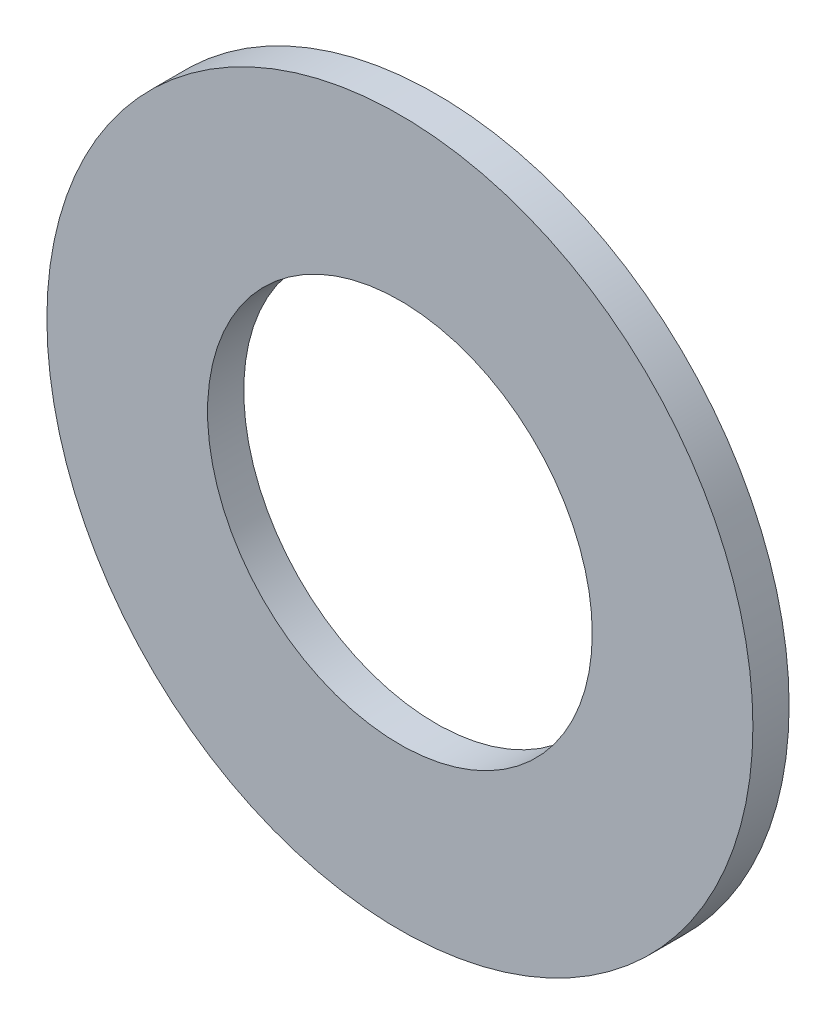
ISO-10303-21;
HEADER;
FILE_DESCRIPTION(('STEP AP214'),'2;1');
FILE_NAME('part.step','',(''),(''),'','','');
FILE_SCHEMA(('AUTOMOTIVE_DESIGN { 1 0 10303 214 1 1 1 1 }'));
ENDSEC;
DATA;
#1=APPLICATION_CONTEXT('core data for automotive mechanical design processes');
#2=APPLICATION_PROTOCOL_DEFINITION('international standard','automotive_design',2000,#1);
#3=PRODUCT_CONTEXT('',#1,'mechanical');
#4=PRODUCT('Part','Part','',(#3));
#5=PRODUCT_RELATED_PRODUCT_CATEGORY('part','',(#4));
#6=PRODUCT_DEFINITION_FORMATION('','',#4);
#7=PRODUCT_DEFINITION_CONTEXT('part definition',#1,'design');
#8=PRODUCT_DEFINITION('design','',#6,#7);
#9=PRODUCT_DEFINITION_SHAPE('','',#8);
#10=(LENGTH_UNIT() NAMED_UNIT(*) SI_UNIT(.MILLI.,.METRE.));
#11=(NAMED_UNIT(*) PLANE_ANGLE_UNIT() SI_UNIT($,.RADIAN.));
#12=(NAMED_UNIT(*) SI_UNIT($,.STERADIAN.) SOLID_ANGLE_UNIT());
#13=UNCERTAINTY_MEASURE_WITH_UNIT(LENGTH_MEASURE(1.E-05),#10,'distance_accuracy_value','');
#14=(GEOMETRIC_REPRESENTATION_CONTEXT(3) GLOBAL_UNCERTAINTY_ASSIGNED_CONTEXT((#13)) GLOBAL_UNIT_ASSIGNED_CONTEXT((#10,
#11,#12)) REPRESENTATION_CONTEXT('',''));
#15=CARTESIAN_POINT('',(0.,0.,0.));
#16=DIRECTION('',(0.,0.,1.));
#17=DIRECTION('',(1.,0.,0.));
#18=AXIS2_PLACEMENT_3D('',#15,#16,#17);
#19=CARTESIAN_POINT('',(0.,0.,8.));
#20=DIRECTION('',(0.,0.,1.));
#21=DIRECTION('',(1.,0.,0.));
#22=AXIS2_PLACEMENT_3D('',#19,#20,#21);
#23=PLANE('',#22);
#24=CARTESIAN_POINT('',(0.,0.,8.));
#25=DIRECTION('',(0.,0.,1.));
#26=DIRECTION('',(1.,0.,0.));
#27=AXIS2_PLACEMENT_3D('',#24,#25,#26);
#28=CIRCLE('',#27,78.);
#29=CARTESIAN_POINT('',(78.,0.,8.));
#30=VERTEX_POINT('',#29);
#31=EDGE_CURVE('E10',#30,#30,#28,.T.);
#32=ORIENTED_EDGE('',*,*,#31,.T.);
#33=EDGE_LOOP('',(#32));
#34=FACE_BOUND('',#33,.T.);
#35=CARTESIAN_POINT('',(0.,0.,8.));
#36=DIRECTION('',(0.,0.,1.));
#37=DIRECTION('',(1.,0.,0.));
#38=AXIS2_PLACEMENT_3D('',#35,#36,#37);
#39=CIRCLE('',#38,42.5);
#40=CARTESIAN_POINT('',(42.5,0.,8.));
#41=VERTEX_POINT('',#40);
#42=EDGE_CURVE('E50',#41,#41,#39,.T.);
#43=ORIENTED_EDGE('',*,*,#42,.F.);
#44=EDGE_LOOP('',(#43));
#45=FACE_BOUND('',#44,.T.);
#46=ADVANCED_FACE('F37',(#34,#45),#23,.T.);
#47=CARTESIAN_POINT('',(0.,0.,0.));
#48=DIRECTION('',(0.,0.,1.));
#49=DIRECTION('',(1.,0.,0.));
#50=AXIS2_PLACEMENT_3D('',#47,#48,#49);
#51=PLANE('',#50);
#52=CARTESIAN_POINT('',(0.,0.,0.));
#53=DIRECTION('',(0.,0.,1.));
#54=DIRECTION('',(1.,0.,0.));
#55=AXIS2_PLACEMENT_3D('',#52,#53,#54);
#56=CIRCLE('',#55,78.);
#57=CARTESIAN_POINT('',(78.,0.,0.));
#58=VERTEX_POINT('',#57);
#59=EDGE_CURVE('E41',#58,#58,#56,.T.);
#60=ORIENTED_EDGE('',*,*,#59,.F.);
#61=EDGE_LOOP('',(#60));
#62=FACE_BOUND('',#61,.T.);
#63=CARTESIAN_POINT('',(0.,0.,0.));
#64=DIRECTION('',(0.,0.,1.));
#65=DIRECTION('',(1.,0.,0.));
#66=AXIS2_PLACEMENT_3D('',#63,#64,#65);
#67=CIRCLE('',#66,42.5);
#68=CARTESIAN_POINT('',(42.5,0.,0.));
#69=VERTEX_POINT('',#68);
#70=EDGE_CURVE('E52',#69,#69,#67,.T.);
#71=ORIENTED_EDGE('',*,*,#70,.T.);
#72=EDGE_LOOP('',(#71));
#73=FACE_BOUND('',#72,.T.);
#74=ADVANCED_FACE('F64',(#62,#73),#51,.F.);
#75=CARTESIAN_POINT('',(0.,0.,8.));
#76=DIRECTION('',(0.,0.,-1.));
#77=DIRECTION('',(-1.,0.,0.));
#78=AXIS2_PLACEMENT_3D('',#75,#76,#77);
#79=CYLINDRICAL_SURFACE('',#78,78.);
#80=ORIENTED_EDGE('',*,*,#31,.F.);
#81=EDGE_LOOP('',(#80));
#82=FACE_BOUND('',#81,.T.);
#83=ORIENTED_EDGE('',*,*,#59,.T.);
#84=EDGE_LOOP('',(#83));
#85=FACE_BOUND('',#84,.T.);
#86=ADVANCED_FACE('F39',(#82,#85),#79,.T.);
#87=CARTESIAN_POINT('',(0.,0.,8.));
#88=DIRECTION('',(0.,0.,-1.));
#89=DIRECTION('',(-1.,0.,0.));
#90=AXIS2_PLACEMENT_3D('',#87,#88,#89);
#91=CYLINDRICAL_SURFACE('',#90,42.5);
#92=ORIENTED_EDGE('',*,*,#42,.T.);
#93=EDGE_LOOP('',(#92));
#94=FACE_BOUND('',#93,.T.);
#95=ORIENTED_EDGE('',*,*,#70,.F.);
#96=EDGE_LOOP('',(#95));
#97=FACE_BOUND('',#96,.T.);
#98=ADVANCED_FACE('F60',(#94,#97),#91,.F.);
#99=CLOSED_SHELL('',(#46,#74,#86,#98));
#100=MANIFOLD_SOLID_BREP('B2',#99);
#101=ADVANCED_BREP_SHAPE_REPRESENTATION('',(#18,#100),#14);
#102=SHAPE_DEFINITION_REPRESENTATION(#9,#101);
ENDSEC;
END-ISO-10303-21;
